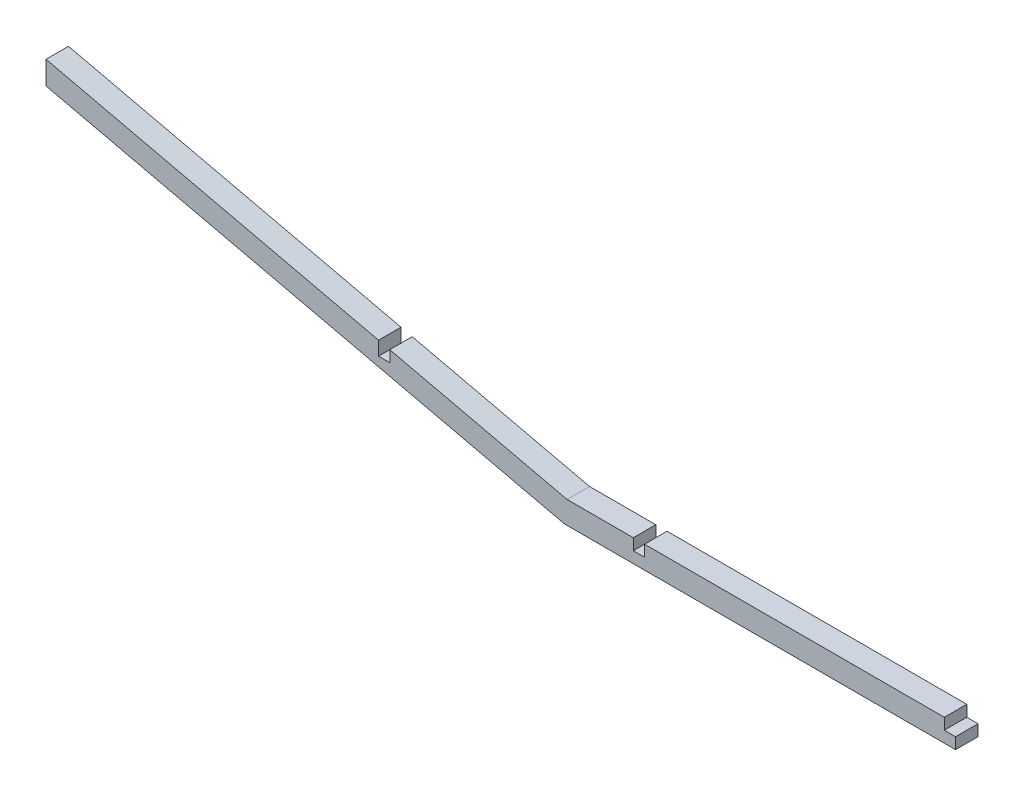
ISO-10303-21;
HEADER;
FILE_DESCRIPTION(('STEP AP214'),'2;1');
FILE_NAME('part.step','',(''),(''),'','','');
FILE_SCHEMA(('AUTOMOTIVE_DESIGN { 1 0 10303 214 1 1 1 1 }'));
ENDSEC;
DATA;
#1=APPLICATION_CONTEXT('core data for automotive mechanical design processes');
#2=APPLICATION_PROTOCOL_DEFINITION('international standard','automotive_design',2000,#1);
#3=PRODUCT_CONTEXT('',#1,'mechanical');
#4=PRODUCT('Part','Part','',(#3));
#5=PRODUCT_RELATED_PRODUCT_CATEGORY('part','',(#4));
#6=PRODUCT_DEFINITION_FORMATION('','',#4);
#7=PRODUCT_DEFINITION_CONTEXT('part definition',#1,'design');
#8=PRODUCT_DEFINITION('design','',#6,#7);
#9=PRODUCT_DEFINITION_SHAPE('','',#8);
#10=(LENGTH_UNIT() NAMED_UNIT(*) SI_UNIT(.MILLI.,.METRE.));
#11=(NAMED_UNIT(*) PLANE_ANGLE_UNIT() SI_UNIT($,.RADIAN.));
#12=(NAMED_UNIT(*) SI_UNIT($,.STERADIAN.) SOLID_ANGLE_UNIT());
#13=UNCERTAINTY_MEASURE_WITH_UNIT(LENGTH_MEASURE(1.E-05),#10,'distance_accuracy_value','');
#14=(GEOMETRIC_REPRESENTATION_CONTEXT(3) GLOBAL_UNCERTAINTY_ASSIGNED_CONTEXT((#13)) GLOBAL_UNIT_ASSIGNED_CONTEXT((#10,
#11,#12)) REPRESENTATION_CONTEXT('',''));
#15=CARTESIAN_POINT('',(0.,0.,0.));
#16=DIRECTION('',(0.,0.,1.));
#17=DIRECTION('',(1.,0.,0.));
#18=AXIS2_PLACEMENT_3D('',#15,#16,#17);
#19=CARTESIAN_POINT('',(-242.75,38.2090830078207,6.));
#20=DIRECTION('',(1.,0.,0.));
#21=DIRECTION('',(0.,0.,-1.));
#22=AXIS2_PLACEMENT_3D('',#19,#20,#21);
#23=PLANE('',#22);
#24=DIRECTION('',(0.,-1.,0.));
#25=VECTOR('',#24,1.);
#26=CARTESIAN_POINT('',(-242.75,38.2090830078207,0.));
#27=LINE('',#26,#25);
#28=CARTESIAN_POINT('',(-242.75,38.2090830078207,0.));
#29=VERTEX_POINT('',#28);
#30=CARTESIAN_POINT('',(-242.75,32.0502723496879,0.));
#31=VERTEX_POINT('',#30);
#32=EDGE_CURVE('E181',#29,#31,#27,.T.);
#33=ORIENTED_EDGE('',*,*,#32,.T.);
#34=DIRECTION('',(0.,0.,-1.));
#35=VECTOR('',#34,1.);
#36=CARTESIAN_POINT('',(-242.75,32.0502723496879,6.));
#37=LINE('',#36,#35);
#38=CARTESIAN_POINT('',(-242.75,32.0502723496879,6.));
#39=VERTEX_POINT('',#38);
#40=EDGE_CURVE('E11',#39,#31,#37,.T.);
#41=ORIENTED_EDGE('',*,*,#40,.F.);
#42=DIRECTION('',(0.,-1.,0.));
#43=VECTOR('',#42,1.);
#44=CARTESIAN_POINT('',(-242.75,38.2090830078207,6.));
#45=LINE('',#44,#43);
#46=CARTESIAN_POINT('',(-242.75,38.2090830078207,6.));
#47=VERTEX_POINT('',#46);
#48=EDGE_CURVE('E211',#47,#39,#45,.T.);
#49=ORIENTED_EDGE('',*,*,#48,.F.);
#50=DIRECTION('',(0.,0.,-1.));
#51=VECTOR('',#50,1.);
#52=CARTESIAN_POINT('',(-242.75,38.2090830078207,6.));
#53=LINE('',#52,#51);
#54=EDGE_CURVE('E177',#47,#29,#53,.T.);
#55=ORIENTED_EDGE('',*,*,#54,.T.);
#56=EDGE_LOOP('',(#33,#41,#49,#55));
#57=FACE_BOUND('',#56,.T.);
#58=ADVANCED_FACE('F37',(#57),#23,.F.);
#59=CARTESIAN_POINT('',(-242.75,32.0502723496879,6.));
#60=DIRECTION('',(0.22562567464885,0.974214070386612,0.));
#61=DIRECTION('',(-0.974214070386613,0.22562567464885,0.));
#62=AXIS2_PLACEMENT_3D('',#59,#60,#61);
#63=PLANE('',#62);
#64=DIRECTION('',(0.974214070386612,-0.22562567464885,0.));
#65=VECTOR('',#64,1.);
#66=CARTESIAN_POINT('',(-242.75,32.0502723496879,0.));
#67=LINE('',#66,#65);
#68=CARTESIAN_POINT('',(-104.36226406798,0.,0.));
#69=VERTEX_POINT('',#68);
#70=EDGE_CURVE('E184',#31,#69,#67,.T.);
#71=ORIENTED_EDGE('',*,*,#70,.T.);
#72=DIRECTION('',(0.,0.,-1.));
#73=VECTOR('',#72,1.);
#74=CARTESIAN_POINT('',(-104.36226406798,0.,6.));
#75=LINE('',#74,#73);
#76=CARTESIAN_POINT('',(-104.36226406798,0.,6.));
#77=VERTEX_POINT('',#76);
#78=EDGE_CURVE('E45',#77,#69,#75,.T.);
#79=ORIENTED_EDGE('',*,*,#78,.F.);
#80=DIRECTION('',(0.974214070386612,-0.22562567464885,0.));
#81=VECTOR('',#80,1.);
#82=CARTESIAN_POINT('',(-242.75,32.0502723496879,6.));
#83=LINE('',#82,#81);
#84=EDGE_CURVE('E120',#39,#77,#83,.T.);
#85=ORIENTED_EDGE('',*,*,#84,.F.);
#86=ORIENTED_EDGE('',*,*,#40,.T.);
#87=EDGE_LOOP('',(#71,#79,#85,#86));
#88=FACE_BOUND('',#87,.T.);
#89=ADVANCED_FACE('F309',(#88),#63,.F.);
#90=CARTESIAN_POINT('',(-104.36226406798,0.,6.));
#91=DIRECTION('',(0.,1.,0.));
#92=DIRECTION('',(0.,0.,1.));
#93=AXIS2_PLACEMENT_3D('',#90,#91,#92);
#94=PLANE('',#93);
#95=DIRECTION('',(1.,0.,0.));
#96=VECTOR('',#95,1.);
#97=CARTESIAN_POINT('',(-104.36226406798,0.,0.));
#98=LINE('',#97,#96);
#99=CARTESIAN_POINT('',(0.,0.,0.));
#100=VERTEX_POINT('',#99);
#101=EDGE_CURVE('E186',#69,#100,#98,.T.);
#102=ORIENTED_EDGE('',*,*,#101,.T.);
#103=DIRECTION('',(0.,0.,-1.));
#104=VECTOR('',#103,1.);
#105=CARTESIAN_POINT('',(0.,0.,6.));
#106=LINE('',#105,#104);
#107=CARTESIAN_POINT('',(0.,0.,6.));
#108=VERTEX_POINT('',#107);
#109=EDGE_CURVE('E242',#108,#100,#106,.T.);
#110=ORIENTED_EDGE('',*,*,#109,.F.);
#111=DIRECTION('',(1.,0.,0.));
#112=VECTOR('',#111,1.);
#113=CARTESIAN_POINT('',(-104.36226406798,0.,6.));
#114=LINE('',#113,#112);
#115=EDGE_CURVE('E250',#77,#108,#114,.T.);
#116=ORIENTED_EDGE('',*,*,#115,.F.);
#117=ORIENTED_EDGE('',*,*,#78,.T.);
#118=EDGE_LOOP('',(#102,#110,#116,#117));
#119=FACE_BOUND('',#118,.T.);
#120=ADVANCED_FACE('F248',(#119),#94,.F.);
#121=CARTESIAN_POINT('',(0.,0.,6.));
#122=DIRECTION('',(-1.,0.,0.));
#123=DIRECTION('',(0.,-1.,0.));
#124=AXIS2_PLACEMENT_3D('',#121,#122,#123);
#125=PLANE('',#124);
#126=DIRECTION('',(0.,1.,0.));
#127=VECTOR('',#126,1.);
#128=CARTESIAN_POINT('',(0.,0.,0.));
#129=LINE('',#128,#127);
#130=CARTESIAN_POINT('',(0.,3.,0.));
#131=VERTEX_POINT('',#130);
#132=EDGE_CURVE('E188',#100,#131,#129,.T.);
#133=ORIENTED_EDGE('',*,*,#132,.T.);
#134=DIRECTION('',(0.,0.,-1.));
#135=VECTOR('',#134,1.);
#136=CARTESIAN_POINT('',(0.,3.,6.));
#137=LINE('',#136,#135);
#138=CARTESIAN_POINT('',(0.,3.,6.));
#139=VERTEX_POINT('',#138);
#140=EDGE_CURVE('E239',#139,#131,#137,.T.);
#141=ORIENTED_EDGE('',*,*,#140,.F.);
#142=DIRECTION('',(0.,1.,0.));
#143=VECTOR('',#142,1.);
#144=CARTESIAN_POINT('',(0.,0.,6.));
#145=LINE('',#144,#143);
#146=EDGE_CURVE('E268',#108,#139,#145,.T.);
#147=ORIENTED_EDGE('',*,*,#146,.F.);
#148=ORIENTED_EDGE('',*,*,#109,.T.);
#149=EDGE_LOOP('',(#133,#141,#147,#148));
#150=FACE_BOUND('',#149,.T.);
#151=ADVANCED_FACE('F259',(#150),#125,.F.);
#152=CARTESIAN_POINT('',(0.,3.,6.));
#153=DIRECTION('',(0.,-1.,0.));
#154=DIRECTION('',(1.,0.,0.));
#155=AXIS2_PLACEMENT_3D('',#152,#153,#154);
#156=PLANE('',#155);
#157=DIRECTION('',(-1.,0.,0.));
#158=VECTOR('',#157,1.);
#159=CARTESIAN_POINT('',(0.,3.,0.));
#160=LINE('',#159,#158);
#161=CARTESIAN_POINT('',(-3.,3.,0.));
#162=VERTEX_POINT('',#161);
#163=EDGE_CURVE('E190',#131,#162,#160,.T.);
#164=ORIENTED_EDGE('',*,*,#163,.T.);
#165=DIRECTION('',(0.,0.,-1.));
#166=VECTOR('',#165,1.);
#167=CARTESIAN_POINT('',(-3.,3.,6.));
#168=LINE('',#167,#166);
#169=CARTESIAN_POINT('',(-3.,3.,6.));
#170=VERTEX_POINT('',#169);
#171=EDGE_CURVE('E236',#170,#162,#168,.T.);
#172=ORIENTED_EDGE('',*,*,#171,.F.);
#173=DIRECTION('',(-1.,0.,0.));
#174=VECTOR('',#173,1.);
#175=CARTESIAN_POINT('',(0.,3.,6.));
#176=LINE('',#175,#174);
#177=EDGE_CURVE('E265',#139,#170,#176,.T.);
#178=ORIENTED_EDGE('',*,*,#177,.F.);
#179=ORIENTED_EDGE('',*,*,#140,.T.);
#180=EDGE_LOOP('',(#164,#172,#178,#179));
#181=FACE_BOUND('',#180,.T.);
#182=ADVANCED_FACE('F263',(#181),#156,.F.);
#183=CARTESIAN_POINT('',(-3.,3.,6.));
#184=DIRECTION('',(-1.,0.,0.));
#185=DIRECTION('',(0.,0.,1.));
#186=AXIS2_PLACEMENT_3D('',#183,#184,#185);
#187=PLANE('',#186);
#188=DIRECTION('',(0.,1.,0.));
#189=VECTOR('',#188,1.);
#190=CARTESIAN_POINT('',(-3.,3.,0.));
#191=LINE('',#190,#189);
#192=CARTESIAN_POINT('',(-3.,6.,0.));
#193=VERTEX_POINT('',#192);
#194=EDGE_CURVE('E192',#162,#193,#191,.T.);
#195=ORIENTED_EDGE('',*,*,#194,.T.);
#196=DIRECTION('',(0.,0.,-1.));
#197=VECTOR('',#196,1.);
#198=CARTESIAN_POINT('',(-3.,6.,6.));
#199=LINE('',#198,#197);
#200=CARTESIAN_POINT('',(-3.,6.,6.));
#201=VERTEX_POINT('',#200);
#202=EDGE_CURVE('E233',#201,#193,#199,.T.);
#203=ORIENTED_EDGE('',*,*,#202,.F.);
#204=DIRECTION('',(0.,1.,0.));
#205=VECTOR('',#204,1.);
#206=CARTESIAN_POINT('',(-3.,3.,6.));
#207=LINE('',#206,#205);
#208=EDGE_CURVE('E267',#170,#201,#207,.T.);
#209=ORIENTED_EDGE('',*,*,#208,.F.);
#210=ORIENTED_EDGE('',*,*,#171,.T.);
#211=EDGE_LOOP('',(#195,#203,#209,#210));
#212=FACE_BOUND('',#211,.T.);
#213=ADVANCED_FACE('F322',(#212),#187,.F.);
#214=CARTESIAN_POINT('',(-3.,6.,6.));
#215=DIRECTION('',(0.,-1.,0.));
#216=DIRECTION('',(1.,0.,0.));
#217=AXIS2_PLACEMENT_3D('',#214,#215,#216);
#218=PLANE('',#217);
#219=DIRECTION('',(-1.,0.,0.));
#220=VECTOR('',#219,1.);
#221=CARTESIAN_POINT('',(-3.,6.,0.));
#222=LINE('',#221,#220);
#223=CARTESIAN_POINT('',(-83.,5.99999999999999,0.));
#224=VERTEX_POINT('',#223);
#225=EDGE_CURVE('E194',#193,#224,#222,.T.);
#226=ORIENTED_EDGE('',*,*,#225,.T.);
#227=DIRECTION('',(0.,0.,-1.));
#228=VECTOR('',#227,1.);
#229=CARTESIAN_POINT('',(-83.,5.99999999999999,6.));
#230=LINE('',#229,#228);
#231=CARTESIAN_POINT('',(-83.,5.99999999999999,6.));
#232=VERTEX_POINT('',#231);
#233=EDGE_CURVE('E230',#232,#224,#230,.T.);
#234=ORIENTED_EDGE('',*,*,#233,.F.);
#235=DIRECTION('',(-1.,0.,0.));
#236=VECTOR('',#235,1.);
#237=CARTESIAN_POINT('',(-3.,6.,6.));
#238=LINE('',#237,#236);
#239=EDGE_CURVE('E270',#201,#232,#238,.T.);
#240=ORIENTED_EDGE('',*,*,#239,.F.);
#241=ORIENTED_EDGE('',*,*,#202,.T.);
#242=EDGE_LOOP('',(#226,#234,#240,#241));
#243=FACE_BOUND('',#242,.T.);
#244=ADVANCED_FACE('F325',(#243),#218,.F.);
#245=CARTESIAN_POINT('',(-83.,5.99999999999999,6.));
#246=DIRECTION('',(1.,0.,0.));
#247=DIRECTION('',(0.,1.,0.));
#248=AXIS2_PLACEMENT_3D('',#245,#246,#247);
#249=PLANE('',#248);
#250=DIRECTION('',(0.,-1.,0.));
#251=VECTOR('',#250,1.);
#252=CARTESIAN_POINT('',(-83.,5.99999999999999,0.));
#253=LINE('',#252,#251);
#254=CARTESIAN_POINT('',(-83.,2.99999999999999,0.));
#255=VERTEX_POINT('',#254);
#256=EDGE_CURVE('E196',#224,#255,#253,.T.);
#257=ORIENTED_EDGE('',*,*,#256,.T.);
#258=DIRECTION('',(0.,0.,-1.));
#259=VECTOR('',#258,1.);
#260=CARTESIAN_POINT('',(-83.,2.99999999999999,6.));
#261=LINE('',#260,#259);
#262=CARTESIAN_POINT('',(-83.,2.99999999999999,6.));
#263=VERTEX_POINT('',#262);
#264=EDGE_CURVE('E227',#263,#255,#261,.T.);
#265=ORIENTED_EDGE('',*,*,#264,.F.);
#266=DIRECTION('',(0.,-1.,0.));
#267=VECTOR('',#266,1.);
#268=CARTESIAN_POINT('',(-83.,5.99999999999999,6.));
#269=LINE('',#268,#267);
#270=EDGE_CURVE('E276',#232,#263,#269,.T.);
#271=ORIENTED_EDGE('',*,*,#270,.F.);
#272=ORIENTED_EDGE('',*,*,#233,.T.);
#273=EDGE_LOOP('',(#257,#265,#271,#272));
#274=FACE_BOUND('',#273,.T.);
#275=ADVANCED_FACE('F329',(#274),#249,.F.);
#276=CARTESIAN_POINT('',(-83.,2.99999999999999,6.));
#277=DIRECTION('',(0.,-1.,0.));
#278=DIRECTION('',(1.,0.,0.));
#279=AXIS2_PLACEMENT_3D('',#276,#277,#278);
#280=PLANE('',#279);
#281=DIRECTION('',(-1.,0.,0.));
#282=VECTOR('',#281,1.);
#283=CARTESIAN_POINT('',(-83.,2.99999999999999,0.));
#284=LINE('',#283,#282);
#285=CARTESIAN_POINT('',(-86.,2.99999999999999,0.));
#286=VERTEX_POINT('',#285);
#287=EDGE_CURVE('E198',#255,#286,#284,.T.);
#288=ORIENTED_EDGE('',*,*,#287,.T.);
#289=DIRECTION('',(0.,0.,-1.));
#290=VECTOR('',#289,1.);
#291=CARTESIAN_POINT('',(-86.,2.99999999999999,6.));
#292=LINE('',#291,#290);
#293=CARTESIAN_POINT('',(-86.,2.99999999999999,6.));
#294=VERTEX_POINT('',#293);
#295=EDGE_CURVE('E224',#294,#286,#292,.T.);
#296=ORIENTED_EDGE('',*,*,#295,.F.);
#297=DIRECTION('',(-1.,0.,0.));
#298=VECTOR('',#297,1.);
#299=CARTESIAN_POINT('',(-83.,2.99999999999999,6.));
#300=LINE('',#299,#298);
#301=EDGE_CURVE('E278',#263,#294,#300,.T.);
#302=ORIENTED_EDGE('',*,*,#301,.F.);
#303=ORIENTED_EDGE('',*,*,#264,.T.);
#304=EDGE_LOOP('',(#288,#296,#302,#303));
#305=FACE_BOUND('',#304,.T.);
#306=ADVANCED_FACE('F333',(#305),#280,.F.);
#307=CARTESIAN_POINT('',(-86.,2.99999999999999,6.));
#308=DIRECTION('',(-1.,0.,0.));
#309=DIRECTION('',(0.,0.,1.));
#310=AXIS2_PLACEMENT_3D('',#307,#308,#309);
#311=PLANE('',#310);
#312=DIRECTION('',(0.,1.,0.));
#313=VECTOR('',#312,1.);
#314=CARTESIAN_POINT('',(-86.,2.99999999999999,0.));
#315=LINE('',#314,#313);
#316=CARTESIAN_POINT('',(-86.,5.99999999999999,0.));
#317=VERTEX_POINT('',#316);
#318=EDGE_CURVE('E200',#286,#317,#315,.T.);
#319=ORIENTED_EDGE('',*,*,#318,.T.);
#320=DIRECTION('',(0.,0.,-1.));
#321=VECTOR('',#320,1.);
#322=CARTESIAN_POINT('',(-86.,5.99999999999999,6.));
#323=LINE('',#322,#321);
#324=CARTESIAN_POINT('',(-86.,5.99999999999999,6.));
#325=VERTEX_POINT('',#324);
#326=EDGE_CURVE('E221',#325,#317,#323,.T.);
#327=ORIENTED_EDGE('',*,*,#326,.F.);
#328=DIRECTION('',(0.,1.,0.));
#329=VECTOR('',#328,1.);
#330=CARTESIAN_POINT('',(-86.,2.99999999999999,6.));
#331=LINE('',#330,#329);
#332=EDGE_CURVE('E280',#294,#325,#331,.T.);
#333=ORIENTED_EDGE('',*,*,#332,.F.);
#334=ORIENTED_EDGE('',*,*,#295,.T.);
#335=EDGE_LOOP('',(#319,#327,#333,#334));
#336=FACE_BOUND('',#335,.T.);
#337=ADVANCED_FACE('F337',(#336),#311,.F.);
#338=CARTESIAN_POINT('',(-86.,5.99999999999999,6.));
#339=DIRECTION('',(0.,-1.,0.));
#340=DIRECTION('',(1.,0.,0.));
#341=AXIS2_PLACEMENT_3D('',#338,#339,#340);
#342=PLANE('',#341);
#343=DIRECTION('',(-1.,0.,0.));
#344=VECTOR('',#343,1.);
#345=CARTESIAN_POINT('',(-86.,5.99999999999999,0.));
#346=LINE('',#345,#344);
#347=CARTESIAN_POINT('',(-103.676546106489,5.99999999999999,0.));
#348=VERTEX_POINT('',#347);
#349=EDGE_CURVE('E202',#317,#348,#346,.T.);
#350=ORIENTED_EDGE('',*,*,#349,.T.);
#351=DIRECTION('',(0.,0.,-1.));
#352=VECTOR('',#351,1.);
#353=CARTESIAN_POINT('',(-103.676546106489,5.99999999999999,6.));
#354=LINE('',#353,#352);
#355=CARTESIAN_POINT('',(-103.676546106489,5.99999999999999,6.));
#356=VERTEX_POINT('',#355);
#357=EDGE_CURVE('E218',#356,#348,#354,.T.);
#358=ORIENTED_EDGE('',*,*,#357,.F.);
#359=DIRECTION('',(-1.,0.,0.));
#360=VECTOR('',#359,1.);
#361=CARTESIAN_POINT('',(-86.,5.99999999999999,6.));
#362=LINE('',#361,#360);
#363=EDGE_CURVE('E282',#325,#356,#362,.T.);
#364=ORIENTED_EDGE('',*,*,#363,.F.);
#365=ORIENTED_EDGE('',*,*,#326,.T.);
#366=EDGE_LOOP('',(#350,#358,#364,#365));
#367=FACE_BOUND('',#366,.T.);
#368=ADVANCED_FACE('F341',(#367),#342,.F.);
#369=CARTESIAN_POINT('',(-103.676546106489,5.99999999999999,6.));
#370=DIRECTION('',(-0.22562567464885,-0.974214070386612,0.));
#371=DIRECTION('',(0.974214070386612,-0.22562567464885,0.));
#372=AXIS2_PLACEMENT_3D('',#369,#370,#371);
#373=PLANE('',#372);
#374=DIRECTION('',(-0.974214070386612,0.22562567464885,0.));
#375=VECTOR('',#374,1.);
#376=CARTESIAN_POINT('',(-103.676546106489,5.99999999999999,0.));
#377=LINE('',#376,#375);
#378=CARTESIAN_POINT('',(-151.,16.96,0.));
#379=VERTEX_POINT('',#378);
#380=EDGE_CURVE('E204',#348,#379,#377,.T.);
#381=ORIENTED_EDGE('',*,*,#380,.T.);
#382=DIRECTION('',(0.,0.,-1.));
#383=VECTOR('',#382,1.);
#384=CARTESIAN_POINT('',(-151.,16.96,6.));
#385=LINE('',#384,#383);
#386=CARTESIAN_POINT('',(-151.,16.96,6.));
#387=VERTEX_POINT('',#386);
#388=EDGE_CURVE('E215',#387,#379,#385,.T.);
#389=ORIENTED_EDGE('',*,*,#388,.F.);
#390=DIRECTION('',(-0.974214070386612,0.22562567464885,0.));
#391=VECTOR('',#390,1.);
#392=CARTESIAN_POINT('',(-103.676546106489,5.99999999999999,6.));
#393=LINE('',#392,#391);
#394=EDGE_CURVE('E284',#356,#387,#393,.T.);
#395=ORIENTED_EDGE('',*,*,#394,.F.);
#396=ORIENTED_EDGE('',*,*,#357,.T.);
#397=EDGE_LOOP('',(#381,#389,#395,#396));
#398=FACE_BOUND('',#397,.T.);
#399=ADVANCED_FACE('F290',(#398),#373,.F.);
#400=CARTESIAN_POINT('',(-151.,16.96,6.));
#401=DIRECTION('',(1.,0.,0.));
#402=DIRECTION('',(0.,0.,-1.));
#403=AXIS2_PLACEMENT_3D('',#400,#401,#402);
#404=PLANE('',#403);
#405=DIRECTION('',(0.,-1.,0.));
#406=VECTOR('',#405,1.);
#407=CARTESIAN_POINT('',(-151.,16.96,0.));
#408=LINE('',#407,#406);
#409=CARTESIAN_POINT('',(-151.,13.96,0.));
#410=VERTEX_POINT('',#409);
#411=EDGE_CURVE('E206',#379,#410,#408,.T.);
#412=ORIENTED_EDGE('',*,*,#411,.T.);
#413=DIRECTION('',(0.,0.,-1.));
#414=VECTOR('',#413,1.);
#415=CARTESIAN_POINT('',(-151.,13.96,6.));
#416=LINE('',#415,#414);
#417=CARTESIAN_POINT('',(-151.,13.96,6.));
#418=VERTEX_POINT('',#417);
#419=EDGE_CURVE('E172',#418,#410,#416,.T.);
#420=ORIENTED_EDGE('',*,*,#419,.F.);
#421=DIRECTION('',(0.,-1.,0.));
#422=VECTOR('',#421,1.);
#423=CARTESIAN_POINT('',(-151.,16.96,6.));
#424=LINE('',#423,#422);
#425=EDGE_CURVE('E163',#387,#418,#424,.T.);
#426=ORIENTED_EDGE('',*,*,#425,.F.);
#427=ORIENTED_EDGE('',*,*,#388,.T.);
#428=EDGE_LOOP('',(#412,#420,#426,#427));
#429=FACE_BOUND('',#428,.T.);
#430=ADVANCED_FACE('F294',(#429),#404,.F.);
#431=CARTESIAN_POINT('',(-151.,13.96,6.));
#432=DIRECTION('',(0.,-1.,0.));
#433=DIRECTION('',(0.,0.,-1.));
#434=AXIS2_PLACEMENT_3D('',#431,#432,#433);
#435=PLANE('',#434);
#436=DIRECTION('',(-1.,0.,0.));
#437=VECTOR('',#436,1.);
#438=CARTESIAN_POINT('',(-151.,13.96,0.));
#439=LINE('',#438,#437);
#440=CARTESIAN_POINT('',(-154.,13.96,0.));
#441=VERTEX_POINT('',#440);
#442=EDGE_CURVE('E171',#410,#441,#439,.T.);
#443=ORIENTED_EDGE('',*,*,#442,.T.);
#444=DIRECTION('',(0.,0.,-1.));
#445=VECTOR('',#444,1.);
#446=CARTESIAN_POINT('',(-154.,13.96,6.));
#447=LINE('',#446,#445);
#448=CARTESIAN_POINT('',(-154.,13.96,6.));
#449=VERTEX_POINT('',#448);
#450=EDGE_CURVE('E168',#449,#441,#447,.T.);
#451=ORIENTED_EDGE('',*,*,#450,.F.);
#452=DIRECTION('',(-1.,0.,0.));
#453=VECTOR('',#452,1.);
#454=CARTESIAN_POINT('',(-151.,13.96,6.));
#455=LINE('',#454,#453);
#456=EDGE_CURVE('E157',#418,#449,#455,.T.);
#457=ORIENTED_EDGE('',*,*,#456,.F.);
#458=ORIENTED_EDGE('',*,*,#419,.T.);
#459=EDGE_LOOP('',(#443,#451,#457,#458));
#460=FACE_BOUND('',#459,.T.);
#461=ADVANCED_FACE('F169',(#460),#435,.F.);
#462=CARTESIAN_POINT('',(-154.,13.96,6.));
#463=DIRECTION('',(-1.,0.,0.));
#464=DIRECTION('',(0.,0.,1.));
#465=AXIS2_PLACEMENT_3D('',#462,#463,#464);
#466=PLANE('',#465);
#467=DIRECTION('',(0.,1.,0.));
#468=VECTOR('',#467,1.);
#469=CARTESIAN_POINT('',(-154.,13.96,0.));
#470=LINE('',#469,#468);
#471=CARTESIAN_POINT('',(-154.,17.6547929048878,0.));
#472=VERTEX_POINT('',#471);
#473=EDGE_CURVE('E106',#441,#472,#470,.T.);
#474=ORIENTED_EDGE('',*,*,#473,.T.);
#475=DIRECTION('',(0.,0.,-1.));
#476=VECTOR('',#475,1.);
#477=CARTESIAN_POINT('',(-154.,17.6547929048878,6.));
#478=LINE('',#477,#476);
#479=CARTESIAN_POINT('',(-154.,17.6547929048878,6.));
#480=VERTEX_POINT('',#479);
#481=EDGE_CURVE('E173',#480,#472,#478,.T.);
#482=ORIENTED_EDGE('',*,*,#481,.F.);
#483=DIRECTION('',(0.,1.,0.));
#484=VECTOR('',#483,1.);
#485=CARTESIAN_POINT('',(-154.,13.96,6.));
#486=LINE('',#485,#484);
#487=EDGE_CURVE('E161',#449,#480,#486,.T.);
#488=ORIENTED_EDGE('',*,*,#487,.F.);
#489=ORIENTED_EDGE('',*,*,#450,.T.);
#490=EDGE_LOOP('',(#474,#482,#488,#489));
#491=FACE_BOUND('',#490,.T.);
#492=ADVANCED_FACE('F175',(#491),#466,.F.);
#493=CARTESIAN_POINT('',(-154.,17.6547929048878,6.));
#494=DIRECTION('',(-0.22562567464885,-0.974214070386612,0.));
#495=DIRECTION('',(0.974214070386612,-0.22562567464885,0.));
#496=AXIS2_PLACEMENT_3D('',#493,#494,#495);
#497=PLANE('',#496);
#498=DIRECTION('',(-0.974214070386612,0.22562567464885,0.));
#499=VECTOR('',#498,1.);
#500=CARTESIAN_POINT('',(-154.,17.6547929048878,0.));
#501=LINE('',#500,#499);
#502=EDGE_CURVE('E112',#472,#29,#501,.T.);
#503=ORIENTED_EDGE('',*,*,#502,.T.);
#504=ORIENTED_EDGE('',*,*,#54,.F.);
#505=DIRECTION('',(-0.974214070386612,0.22562567464885,0.));
#506=VECTOR('',#505,1.);
#507=CARTESIAN_POINT('',(-154.,17.6547929048878,6.));
#508=LINE('',#507,#506);
#509=EDGE_CURVE('E53',#480,#47,#508,.T.);
#510=ORIENTED_EDGE('',*,*,#509,.F.);
#511=ORIENTED_EDGE('',*,*,#481,.T.);
#512=EDGE_LOOP('',(#503,#504,#510,#511));
#513=FACE_BOUND('',#512,.T.);
#514=ADVANCED_FACE('F298',(#513),#497,.F.);
#515=CARTESIAN_POINT('',(0.,0.,6.));
#516=DIRECTION('',(0.,0.,1.));
#517=DIRECTION('',(1.,0.,0.));
#518=AXIS2_PLACEMENT_3D('',#515,#516,#517);
#519=PLANE('',#518);
#520=ORIENTED_EDGE('',*,*,#48,.T.);
#521=ORIENTED_EDGE('',*,*,#84,.T.);
#522=ORIENTED_EDGE('',*,*,#115,.T.);
#523=ORIENTED_EDGE('',*,*,#146,.T.);
#524=ORIENTED_EDGE('',*,*,#177,.T.);
#525=ORIENTED_EDGE('',*,*,#208,.T.);
#526=ORIENTED_EDGE('',*,*,#239,.T.);
#527=ORIENTED_EDGE('',*,*,#270,.T.);
#528=ORIENTED_EDGE('',*,*,#301,.T.);
#529=ORIENTED_EDGE('',*,*,#332,.T.);
#530=ORIENTED_EDGE('',*,*,#363,.T.);
#531=ORIENTED_EDGE('',*,*,#394,.T.);
#532=ORIENTED_EDGE('',*,*,#425,.T.);
#533=ORIENTED_EDGE('',*,*,#456,.T.);
#534=ORIENTED_EDGE('',*,*,#487,.T.);
#535=ORIENTED_EDGE('',*,*,#509,.T.);
#536=EDGE_LOOP('',(#520,#521,#522,#523,#524,#525,#526,#527,#528,#529,#530,#531,#532,#533,#534,#535));
#537=FACE_BOUND('',#536,.T.);
#538=ADVANCED_FACE('F159',(#537),#519,.T.);
#539=CARTESIAN_POINT('',(0.,0.,0.));
#540=DIRECTION('',(0.,0.,1.));
#541=DIRECTION('',(1.,0.,0.));
#542=AXIS2_PLACEMENT_3D('',#539,#540,#541);
#543=PLANE('',#542);
#544=ORIENTED_EDGE('',*,*,#32,.F.);
#545=ORIENTED_EDGE('',*,*,#502,.F.);
#546=ORIENTED_EDGE('',*,*,#473,.F.);
#547=ORIENTED_EDGE('',*,*,#442,.F.);
#548=ORIENTED_EDGE('',*,*,#411,.F.);
#549=ORIENTED_EDGE('',*,*,#380,.F.);
#550=ORIENTED_EDGE('',*,*,#349,.F.);
#551=ORIENTED_EDGE('',*,*,#318,.F.);
#552=ORIENTED_EDGE('',*,*,#287,.F.);
#553=ORIENTED_EDGE('',*,*,#256,.F.);
#554=ORIENTED_EDGE('',*,*,#225,.F.);
#555=ORIENTED_EDGE('',*,*,#194,.F.);
#556=ORIENTED_EDGE('',*,*,#163,.F.);
#557=ORIENTED_EDGE('',*,*,#132,.F.);
#558=ORIENTED_EDGE('',*,*,#101,.F.);
#559=ORIENTED_EDGE('',*,*,#70,.F.);
#560=EDGE_LOOP('',(#544,#545,#546,#547,#548,#549,#550,#551,#552,#553,#554,#555,#556,#557,#558,#559));
#561=FACE_BOUND('',#560,.T.);
#562=ADVANCED_FACE('F254',(#561),#543,.F.);
#563=CLOSED_SHELL('',(#58,#89,#120,#151,#182,#213,#244,#275,#306,#337,#368,#399,#430,#461,#492,
#514,#538,#562));
#564=MANIFOLD_SOLID_BREP('B2',#563);
#565=ADVANCED_BREP_SHAPE_REPRESENTATION('',(#18,#564),#14);
#566=SHAPE_DEFINITION_REPRESENTATION(#9,#565);
ENDSEC;
END-ISO-10303-21;
